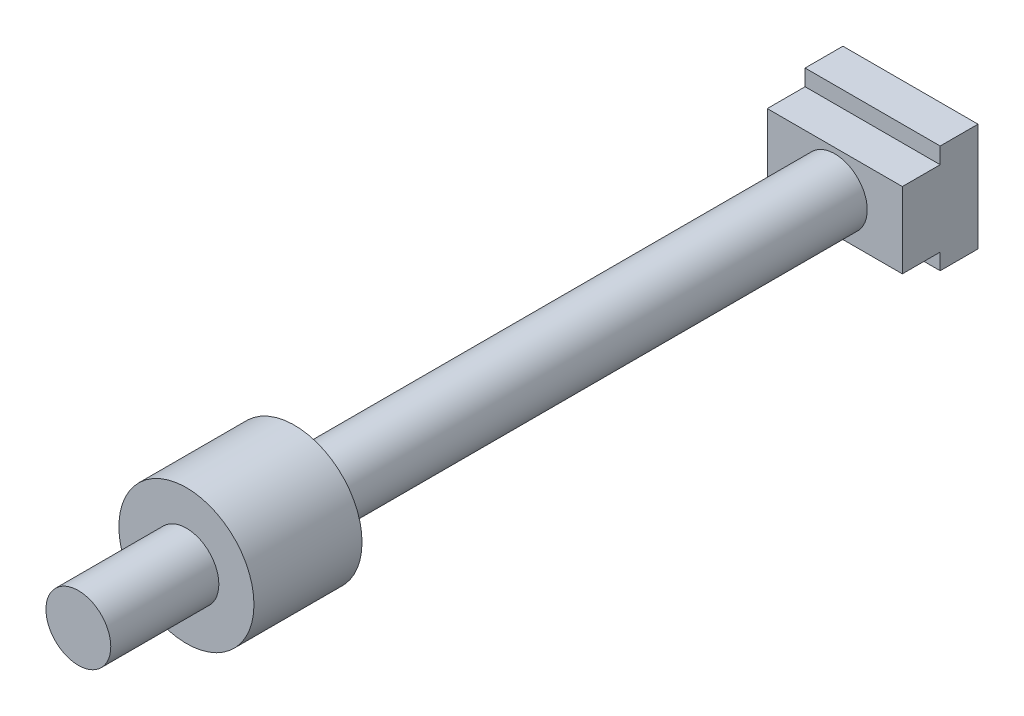
ISO-10303-21;
HEADER;
FILE_DESCRIPTION(('STEP AP214'),'2;1');
FILE_NAME('part.step','',(''),(''),'','','');
FILE_SCHEMA(('AUTOMOTIVE_DESIGN { 1 0 10303 214 1 1 1 1 }'));
ENDSEC;
DATA;
#1=APPLICATION_CONTEXT('core data for automotive mechanical design processes');
#2=APPLICATION_PROTOCOL_DEFINITION('international standard','automotive_design',2000,#1);
#3=PRODUCT_CONTEXT('',#1,'mechanical');
#4=PRODUCT('Part','Part','',(#3));
#5=PRODUCT_RELATED_PRODUCT_CATEGORY('part','',(#4));
#6=PRODUCT_DEFINITION_FORMATION('','',#4);
#7=PRODUCT_DEFINITION_CONTEXT('part definition',#1,'design');
#8=PRODUCT_DEFINITION('design','',#6,#7);
#9=PRODUCT_DEFINITION_SHAPE('','',#8);
#10=(LENGTH_UNIT() NAMED_UNIT(*) SI_UNIT(.MILLI.,.METRE.));
#11=(NAMED_UNIT(*) PLANE_ANGLE_UNIT() SI_UNIT($,.RADIAN.));
#12=(NAMED_UNIT(*) SI_UNIT($,.STERADIAN.) SOLID_ANGLE_UNIT());
#13=UNCERTAINTY_MEASURE_WITH_UNIT(LENGTH_MEASURE(1.E-05),#10,'distance_accuracy_value','');
#14=(GEOMETRIC_REPRESENTATION_CONTEXT(3) GLOBAL_UNCERTAINTY_ASSIGNED_CONTEXT((#13)) GLOBAL_UNIT_ASSIGNED_CONTEXT((#10,
#11,#12)) REPRESENTATION_CONTEXT('',''));
#15=CARTESIAN_POINT('',(0.,0.,0.));
#16=DIRECTION('',(0.,0.,1.));
#17=DIRECTION('',(1.,0.,0.));
#18=AXIS2_PLACEMENT_3D('',#15,#16,#17);
#19=CARTESIAN_POINT('',(0.,0.,100.));
#20=DIRECTION('',(0.,0.,-1.));
#21=DIRECTION('',(-1.,0.,0.));
#22=AXIS2_PLACEMENT_3D('',#19,#20,#21);
#23=CYLINDRICAL_SURFACE('',#22,6.);
#24=CARTESIAN_POINT('',(0.,0.,100.));
#25=DIRECTION('',(0.,0.,1.));
#26=DIRECTION('',(1.,0.,0.));
#27=AXIS2_PLACEMENT_3D('',#24,#25,#26);
#28=CIRCLE('',#27,6.);
#29=CARTESIAN_POINT('',(6.,0.,100.));
#30=VERTEX_POINT('',#29);
#31=EDGE_CURVE('E51',#30,#30,#28,.T.);
#32=ORIENTED_EDGE('',*,*,#31,.F.);
#33=EDGE_LOOP('',(#32));
#34=FACE_BOUND('',#33,.T.);
#35=CARTESIAN_POINT('',(0.,0.,0.));
#36=DIRECTION('',(0.,0.,1.));
#37=DIRECTION('',(1.,0.,0.));
#38=AXIS2_PLACEMENT_3D('',#35,#36,#37);
#39=CIRCLE('',#38,6.);
#40=CARTESIAN_POINT('',(6.,0.,0.));
#41=VERTEX_POINT('',#40);
#42=EDGE_CURVE('E44',#41,#41,#39,.T.);
#43=ORIENTED_EDGE('',*,*,#42,.T.);
#44=EDGE_LOOP('',(#43));
#45=FACE_BOUND('',#44,.T.);
#46=ADVANCED_FACE('F41',(#34,#45),#23,.T.);
#47=CARTESIAN_POINT('',(0.,0.,120.));
#48=DIRECTION('',(0.,0.,-1.));
#49=DIRECTION('',(-1.,0.,0.));
#50=AXIS2_PLACEMENT_3D('',#47,#48,#49);
#51=CYLINDRICAL_SURFACE('',#50,12.5);
#52=CARTESIAN_POINT('',(0.,0.,120.));
#53=DIRECTION('',(0.,0.,1.));
#54=DIRECTION('',(1.,0.,0.));
#55=AXIS2_PLACEMENT_3D('',#52,#53,#54);
#56=CIRCLE('',#55,12.5);
#57=CARTESIAN_POINT('',(12.5,0.,120.));
#58=VERTEX_POINT('',#57);
#59=EDGE_CURVE('E184',#58,#58,#56,.T.);
#60=ORIENTED_EDGE('',*,*,#59,.F.);
#61=EDGE_LOOP('',(#60));
#62=FACE_BOUND('',#61,.T.);
#63=CARTESIAN_POINT('',(0.,0.,100.));
#64=DIRECTION('',(0.,0.,1.));
#65=DIRECTION('',(1.,0.,0.));
#66=AXIS2_PLACEMENT_3D('',#63,#64,#65);
#67=CIRCLE('',#66,12.5);
#68=CARTESIAN_POINT('',(12.5,0.,100.));
#69=VERTEX_POINT('',#68);
#70=EDGE_CURVE('E182',#69,#69,#67,.T.);
#71=ORIENTED_EDGE('',*,*,#70,.T.);
#72=EDGE_LOOP('',(#71));
#73=FACE_BOUND('',#72,.T.);
#74=ADVANCED_FACE('F200',(#62,#73),#51,.T.);
#75=CARTESIAN_POINT('',(0.,0.,120.));
#76=DIRECTION('',(0.,0.,1.));
#77=DIRECTION('',(1.,0.,0.));
#78=AXIS2_PLACEMENT_3D('',#75,#76,#77);
#79=PLANE('',#78);
#80=CARTESIAN_POINT('',(0.,0.,120.));
#81=DIRECTION('',(0.,0.,1.));
#82=DIRECTION('',(1.,0.,0.));
#83=AXIS2_PLACEMENT_3D('',#80,#81,#82);
#84=CIRCLE('',#83,6.);
#85=CARTESIAN_POINT('',(6.,0.,120.));
#86=VERTEX_POINT('',#85);
#87=EDGE_CURVE('E11',#86,#86,#84,.T.);
#88=ORIENTED_EDGE('',*,*,#87,.F.);
#89=EDGE_LOOP('',(#88));
#90=FACE_BOUND('',#89,.T.);
#91=ORIENTED_EDGE('',*,*,#59,.T.);
#92=EDGE_LOOP('',(#91));
#93=FACE_BOUND('',#92,.T.);
#94=ADVANCED_FACE('F313',(#90,#93),#79,.T.);
#95=CARTESIAN_POINT('',(0.,0.,100.));
#96=DIRECTION('',(0.,0.,1.));
#97=DIRECTION('',(1.,0.,0.));
#98=AXIS2_PLACEMENT_3D('',#95,#96,#97);
#99=PLANE('',#98);
#100=ORIENTED_EDGE('',*,*,#31,.T.);
#101=EDGE_LOOP('',(#100));
#102=FACE_BOUND('',#101,.T.);
#103=ORIENTED_EDGE('',*,*,#70,.F.);
#104=EDGE_LOOP('',(#103));
#105=FACE_BOUND('',#104,.T.);
#106=ADVANCED_FACE('F195',(#102,#105),#99,.F.);
#107=CARTESIAN_POINT('',(0.,0.,140.));
#108=DIRECTION('',(0.,0.,-1.));
#109=DIRECTION('',(-1.,0.,0.));
#110=AXIS2_PLACEMENT_3D('',#107,#108,#109);
#111=CYLINDRICAL_SURFACE('',#110,6.);
#112=CARTESIAN_POINT('',(0.,0.,140.));
#113=DIRECTION('',(0.,0.,1.));
#114=DIRECTION('',(1.,0.,0.));
#115=AXIS2_PLACEMENT_3D('',#112,#113,#114);
#116=CIRCLE('',#115,6.);
#117=CARTESIAN_POINT('',(6.,0.,140.));
#118=VERTEX_POINT('',#117);
#119=EDGE_CURVE('E179',#118,#118,#116,.T.);
#120=ORIENTED_EDGE('',*,*,#119,.F.);
#121=EDGE_LOOP('',(#120));
#122=FACE_BOUND('',#121,.T.);
#123=ORIENTED_EDGE('',*,*,#87,.T.);
#124=EDGE_LOOP('',(#123));
#125=FACE_BOUND('',#124,.T.);
#126=ADVANCED_FACE('F308',(#122,#125),#111,.T.);
#127=CARTESIAN_POINT('',(0.,0.,140.));
#128=DIRECTION('',(0.,0.,1.));
#129=DIRECTION('',(1.,0.,0.));
#130=AXIS2_PLACEMENT_3D('',#127,#128,#129);
#131=PLANE('',#130);
#132=ORIENTED_EDGE('',*,*,#119,.T.);
#133=EDGE_LOOP('',(#132));
#134=FACE_BOUND('',#133,.T.);
#135=ADVANCED_FACE('F305',(#134),#131,.T.);
#136=CARTESIAN_POINT('',(-12.5,-7.00000000000001,-6.9999999999999));
#137=DIRECTION('',(1.,0.,0.));
#138=DIRECTION('',(0.,0.,-1.));
#139=AXIS2_PLACEMENT_3D('',#136,#137,#138);
#140=PLANE('',#139);
#141=DIRECTION('',(0.,1.,0.));
#142=VECTOR('',#141,1.);
#143=CARTESIAN_POINT('',(-12.5,-7.00000000000001,0.));
#144=LINE('',#143,#142);
#145=CARTESIAN_POINT('',(-12.5,-7.00000000000001,0.));
#146=VERTEX_POINT('',#145);
#147=CARTESIAN_POINT('',(-12.5,7.00000000000001,0.));
#148=VERTEX_POINT('',#147);
#149=EDGE_CURVE('E145',#146,#148,#144,.T.);
#150=ORIENTED_EDGE('',*,*,#149,.T.);
#151=DIRECTION('',(0.,0.,1.));
#152=VECTOR('',#151,1.);
#153=CARTESIAN_POINT('',(-12.5,7.00000000000001,-6.9999999999999));
#154=LINE('',#153,#152);
#155=CARTESIAN_POINT('',(-12.5,7.00000000000001,-6.9999999999999));
#156=VERTEX_POINT('',#155);
#157=EDGE_CURVE('E176',#156,#148,#154,.T.);
#158=ORIENTED_EDGE('',*,*,#157,.F.);
#159=DIRECTION('',(0.,1.,0.));
#160=VECTOR('',#159,1.);
#161=CARTESIAN_POINT('',(-12.5,-10.,-6.9999999999999));
#162=LINE('',#161,#160);
#163=CARTESIAN_POINT('',(-12.5,9.99999999999979,-6.9999999999999));
#164=VERTEX_POINT('',#163);
#165=EDGE_CURVE('E142',#156,#164,#162,.T.);
#166=ORIENTED_EDGE('',*,*,#165,.T.);
#167=DIRECTION('',(0.,0.,1.));
#168=VECTOR('',#167,1.);
#169=CARTESIAN_POINT('',(-12.5,9.99999999999979,-14.));
#170=LINE('',#169,#168);
#171=CARTESIAN_POINT('',(-12.5,9.99999999999979,-14.));
#172=VERTEX_POINT('',#171);
#173=EDGE_CURVE('E120',#172,#164,#170,.T.);
#174=ORIENTED_EDGE('',*,*,#173,.F.);
#175=DIRECTION('',(0.,1.,0.));
#176=VECTOR('',#175,1.);
#177=CARTESIAN_POINT('',(-12.5,-10.,-14.));
#178=LINE('',#177,#176);
#179=CARTESIAN_POINT('',(-12.5,-10.,-14.));
#180=VERTEX_POINT('',#179);
#181=EDGE_CURVE('E127',#180,#172,#178,.T.);
#182=ORIENTED_EDGE('',*,*,#181,.F.);
#183=DIRECTION('',(0.,0.,1.));
#184=VECTOR('',#183,1.);
#185=CARTESIAN_POINT('',(-12.5,-10.,-14.));
#186=LINE('',#185,#184);
#187=CARTESIAN_POINT('',(-12.5,-10.,-6.9999999999999));
#188=VERTEX_POINT('',#187);
#189=EDGE_CURVE('E249',#180,#188,#186,.T.);
#190=ORIENTED_EDGE('',*,*,#189,.T.);
#191=CARTESIAN_POINT('',(-12.5,-7.00000000000001,-6.9999999999999));
#192=VERTEX_POINT('',#191);
#193=EDGE_CURVE('E228',#188,#192,#162,.T.);
#194=ORIENTED_EDGE('',*,*,#193,.T.);
#195=DIRECTION('',(0.,0.,1.));
#196=VECTOR('',#195,1.);
#197=CARTESIAN_POINT('',(-12.5,-7.00000000000001,-6.9999999999999));
#198=LINE('',#197,#196);
#199=EDGE_CURVE('E161',#192,#146,#198,.T.);
#200=ORIENTED_EDGE('',*,*,#199,.T.);
#201=EDGE_LOOP('',(#150,#158,#166,#174,#182,#190,#194,#200));
#202=FACE_BOUND('',#201,.T.);
#203=ADVANCED_FACE('F140',(#202),#140,.F.);
#204=CARTESIAN_POINT('',(12.5,7.00000000000001,-6.9999999999999));
#205=DIRECTION('',(0.,-1.,0.));
#206=DIRECTION('',(0.,0.,-1.));
#207=AXIS2_PLACEMENT_3D('',#204,#205,#206);
#208=PLANE('',#207);
#209=DIRECTION('',(1.,0.,0.));
#210=VECTOR('',#209,1.);
#211=CARTESIAN_POINT('',(12.5,7.00000000000001,0.));
#212=LINE('',#211,#210);
#213=CARTESIAN_POINT('',(12.5,7.00000000000001,0.));
#214=VERTEX_POINT('',#213);
#215=EDGE_CURVE('E150',#148,#214,#212,.T.);
#216=ORIENTED_EDGE('',*,*,#215,.T.);
#217=DIRECTION('',(0.,0.,1.));
#218=VECTOR('',#217,1.);
#219=CARTESIAN_POINT('',(12.5,7.00000000000001,-6.9999999999999));
#220=LINE('',#219,#218);
#221=CARTESIAN_POINT('',(12.5,7.00000000000001,-6.9999999999999));
#222=VERTEX_POINT('',#221);
#223=EDGE_CURVE('E173',#222,#214,#220,.T.);
#224=ORIENTED_EDGE('',*,*,#223,.F.);
#225=DIRECTION('',(1.,0.,0.));
#226=VECTOR('',#225,1.);
#227=CARTESIAN_POINT('',(12.5,7.00000000000001,-6.9999999999999));
#228=LINE('',#227,#226);
#229=EDGE_CURVE('E87',#156,#222,#228,.T.);
#230=ORIENTED_EDGE('',*,*,#229,.F.);
#231=ORIENTED_EDGE('',*,*,#157,.T.);
#232=EDGE_LOOP('',(#216,#224,#230,#231));
#233=FACE_BOUND('',#232,.T.);
#234=ADVANCED_FACE('F300',(#233),#208,.F.);
#235=CARTESIAN_POINT('',(12.5,-7.00000000000001,-6.9999999999999));
#236=DIRECTION('',(-1.,0.,0.));
#237=DIRECTION('',(0.,0.,1.));
#238=AXIS2_PLACEMENT_3D('',#235,#236,#237);
#239=PLANE('',#238);
#240=DIRECTION('',(0.,-1.,0.));
#241=VECTOR('',#240,1.);
#242=CARTESIAN_POINT('',(12.5,-7.00000000000001,0.));
#243=LINE('',#242,#241);
#244=CARTESIAN_POINT('',(12.5,-7.00000000000001,0.));
#245=VERTEX_POINT('',#244);
#246=EDGE_CURVE('E76',#214,#245,#243,.T.);
#247=ORIENTED_EDGE('',*,*,#246,.T.);
#248=DIRECTION('',(0.,0.,1.));
#249=VECTOR('',#248,1.);
#250=CARTESIAN_POINT('',(12.5,-7.00000000000001,-6.9999999999999));
#251=LINE('',#250,#249);
#252=CARTESIAN_POINT('',(12.5,-7.00000000000001,-6.9999999999999));
#253=VERTEX_POINT('',#252);
#254=EDGE_CURVE('E60',#253,#245,#251,.T.);
#255=ORIENTED_EDGE('',*,*,#254,.F.);
#256=DIRECTION('',(0.,-1.,0.));
#257=VECTOR('',#256,1.);
#258=CARTESIAN_POINT('',(12.5,-10.,-6.9999999999999));
#259=LINE('',#258,#257);
#260=CARTESIAN_POINT('',(12.5,-10.,-6.9999999999999));
#261=VERTEX_POINT('',#260);
#262=EDGE_CURVE('E233',#253,#261,#259,.T.);
#263=ORIENTED_EDGE('',*,*,#262,.T.);
#264=DIRECTION('',(0.,0.,1.));
#265=VECTOR('',#264,1.);
#266=CARTESIAN_POINT('',(12.5,-10.,-14.));
#267=LINE('',#266,#265);
#268=CARTESIAN_POINT('',(12.5,-10.,-14.));
#269=VERTEX_POINT('',#268);
#270=EDGE_CURVE('E152',#269,#261,#267,.T.);
#271=ORIENTED_EDGE('',*,*,#270,.F.);
#272=DIRECTION('',(0.,-1.,0.));
#273=VECTOR('',#272,1.);
#274=CARTESIAN_POINT('',(12.5,-10.,-14.));
#275=LINE('',#274,#273);
#276=CARTESIAN_POINT('',(12.5,9.99999999999979,-14.));
#277=VERTEX_POINT('',#276);
#278=EDGE_CURVE('E126',#277,#269,#275,.T.);
#279=ORIENTED_EDGE('',*,*,#278,.F.);
#280=DIRECTION('',(0.,0.,1.));
#281=VECTOR('',#280,1.);
#282=CARTESIAN_POINT('',(12.5,9.99999999999979,-14.));
#283=LINE('',#282,#281);
#284=CARTESIAN_POINT('',(12.5,9.99999999999979,-6.9999999999999));
#285=VERTEX_POINT('',#284);
#286=EDGE_CURVE('E122',#277,#285,#283,.T.);
#287=ORIENTED_EDGE('',*,*,#286,.T.);
#288=EDGE_CURVE('E237',#285,#222,#259,.T.);
#289=ORIENTED_EDGE('',*,*,#288,.T.);
#290=ORIENTED_EDGE('',*,*,#223,.T.);
#291=EDGE_LOOP('',(#247,#255,#263,#271,#279,#287,#289,#290));
#292=FACE_BOUND('',#291,.T.);
#293=ADVANCED_FACE('F255',(#292),#239,.F.);
#294=CARTESIAN_POINT('',(12.5,-7.00000000000001,-6.9999999999999));
#295=DIRECTION('',(0.,1.,0.));
#296=DIRECTION('',(0.,0.,1.));
#297=AXIS2_PLACEMENT_3D('',#294,#295,#296);
#298=PLANE('',#297);
#299=DIRECTION('',(-1.,0.,0.));
#300=VECTOR('',#299,1.);
#301=CARTESIAN_POINT('',(12.5,-7.00000000000001,0.));
#302=LINE('',#301,#300);
#303=EDGE_CURVE('E81',#245,#146,#302,.T.);
#304=ORIENTED_EDGE('',*,*,#303,.T.);
#305=ORIENTED_EDGE('',*,*,#199,.F.);
#306=DIRECTION('',(-1.,0.,0.));
#307=VECTOR('',#306,1.);
#308=CARTESIAN_POINT('',(12.5,-7.00000000000001,-6.9999999999999));
#309=LINE('',#308,#307);
#310=EDGE_CURVE('E158',#253,#192,#309,.T.);
#311=ORIENTED_EDGE('',*,*,#310,.F.);
#312=ORIENTED_EDGE('',*,*,#254,.T.);
#313=EDGE_LOOP('',(#304,#305,#311,#312));
#314=FACE_BOUND('',#313,.T.);
#315=ADVANCED_FACE('F223',(#314),#298,.F.);
#316=CARTESIAN_POINT('',(0.,0.,0.));
#317=DIRECTION('',(0.,0.,1.));
#318=DIRECTION('',(1.,0.,0.));
#319=AXIS2_PLACEMENT_3D('',#316,#317,#318);
#320=PLANE('',#319);
#321=ORIENTED_EDGE('',*,*,#42,.F.);
#322=EDGE_LOOP('',(#321));
#323=FACE_BOUND('',#322,.T.);
#324=ORIENTED_EDGE('',*,*,#149,.F.);
#325=ORIENTED_EDGE('',*,*,#303,.F.);
#326=ORIENTED_EDGE('',*,*,#246,.F.);
#327=ORIENTED_EDGE('',*,*,#215,.F.);
#328=EDGE_LOOP('',(#324,#325,#326,#327));
#329=FACE_BOUND('',#328,.T.);
#330=ADVANCED_FACE('F219',(#323,#329),#320,.T.);
#331=CARTESIAN_POINT('',(0.,0.,-6.9999999999999));
#332=DIRECTION('',(0.,0.,1.));
#333=DIRECTION('',(1.,0.,0.));
#334=AXIS2_PLACEMENT_3D('',#331,#332,#333);
#335=PLANE('',#334);
#336=ORIENTED_EDGE('',*,*,#165,.F.);
#337=ORIENTED_EDGE('',*,*,#229,.T.);
#338=ORIENTED_EDGE('',*,*,#288,.F.);
#339=DIRECTION('',(1.,0.,0.));
#340=VECTOR('',#339,1.);
#341=CARTESIAN_POINT('',(12.5,9.99999999999979,-6.9999999999999));
#342=LINE('',#341,#340);
#343=EDGE_CURVE('E238',#164,#285,#342,.T.);
#344=ORIENTED_EDGE('',*,*,#343,.F.);
#345=EDGE_LOOP('',(#336,#337,#338,#344));
#346=FACE_BOUND('',#345,.T.);
#347=ADVANCED_FACE('F222',(#346),#335,.T.);
#348=CARTESIAN_POINT('',(12.5,9.99999999999979,-14.));
#349=DIRECTION('',(0.,-1.,0.));
#350=DIRECTION('',(0.,0.,-1.));
#351=AXIS2_PLACEMENT_3D('',#348,#349,#350);
#352=PLANE('',#351);
#353=ORIENTED_EDGE('',*,*,#343,.T.);
#354=ORIENTED_EDGE('',*,*,#286,.F.);
#355=DIRECTION('',(1.,0.,0.));
#356=VECTOR('',#355,1.);
#357=CARTESIAN_POINT('',(12.5,9.99999999999979,-14.));
#358=LINE('',#357,#356);
#359=EDGE_CURVE('E116',#172,#277,#358,.T.);
#360=ORIENTED_EDGE('',*,*,#359,.F.);
#361=ORIENTED_EDGE('',*,*,#173,.T.);
#362=EDGE_LOOP('',(#353,#354,#360,#361));
#363=FACE_BOUND('',#362,.T.);
#364=ADVANCED_FACE('F118',(#363),#352,.F.);
#365=CARTESIAN_POINT('',(12.5,-10.,-14.));
#366=DIRECTION('',(0.,1.,0.));
#367=DIRECTION('',(0.,0.,1.));
#368=AXIS2_PLACEMENT_3D('',#365,#366,#367);
#369=PLANE('',#368);
#370=DIRECTION('',(-1.,0.,0.));
#371=VECTOR('',#370,1.);
#372=CARTESIAN_POINT('',(12.5,-10.,-6.9999999999999));
#373=LINE('',#372,#371);
#374=EDGE_CURVE('E137',#261,#188,#373,.T.);
#375=ORIENTED_EDGE('',*,*,#374,.T.);
#376=ORIENTED_EDGE('',*,*,#189,.F.);
#377=DIRECTION('',(-1.,0.,0.));
#378=VECTOR('',#377,1.);
#379=CARTESIAN_POINT('',(12.5,-10.,-14.));
#380=LINE('',#379,#378);
#381=EDGE_CURVE('E132',#269,#180,#380,.T.);
#382=ORIENTED_EDGE('',*,*,#381,.F.);
#383=ORIENTED_EDGE('',*,*,#270,.T.);
#384=EDGE_LOOP('',(#375,#376,#382,#383));
#385=FACE_BOUND('',#384,.T.);
#386=ADVANCED_FACE('F254',(#385),#369,.F.);
#387=CARTESIAN_POINT('',(0.,0.,-14.));
#388=DIRECTION('',(0.,0.,1.));
#389=DIRECTION('',(1.,0.,0.));
#390=AXIS2_PLACEMENT_3D('',#387,#388,#389);
#391=PLANE('',#390);
#392=ORIENTED_EDGE('',*,*,#181,.T.);
#393=ORIENTED_EDGE('',*,*,#359,.T.);
#394=ORIENTED_EDGE('',*,*,#278,.T.);
#395=ORIENTED_EDGE('',*,*,#381,.T.);
#396=EDGE_LOOP('',(#392,#393,#394,#395));
#397=FACE_BOUND('',#396,.T.);
#398=ADVANCED_FACE('F130',(#397),#391,.F.);
#399=ORIENTED_EDGE('',*,*,#262,.F.);
#400=ORIENTED_EDGE('',*,*,#310,.T.);
#401=ORIENTED_EDGE('',*,*,#193,.F.);
#402=ORIENTED_EDGE('',*,*,#374,.F.);
#403=EDGE_LOOP('',(#399,#400,#401,#402));
#404=FACE_BOUND('',#403,.T.);
#405=ADVANCED_FACE('F231',(#404),#335,.T.);
#406=CLOSED_SHELL('',(#46,#74,#94,#106,#126,#135,#203,#234,#293,#315,#330,#347,#364,#386,#398,#405));
#407=MANIFOLD_SOLID_BREP('B2',#406);
#408=ADVANCED_BREP_SHAPE_REPRESENTATION('',(#18,#407),#14);
#409=SHAPE_DEFINITION_REPRESENTATION(#9,#408);
ENDSEC;
END-ISO-10303-21;
